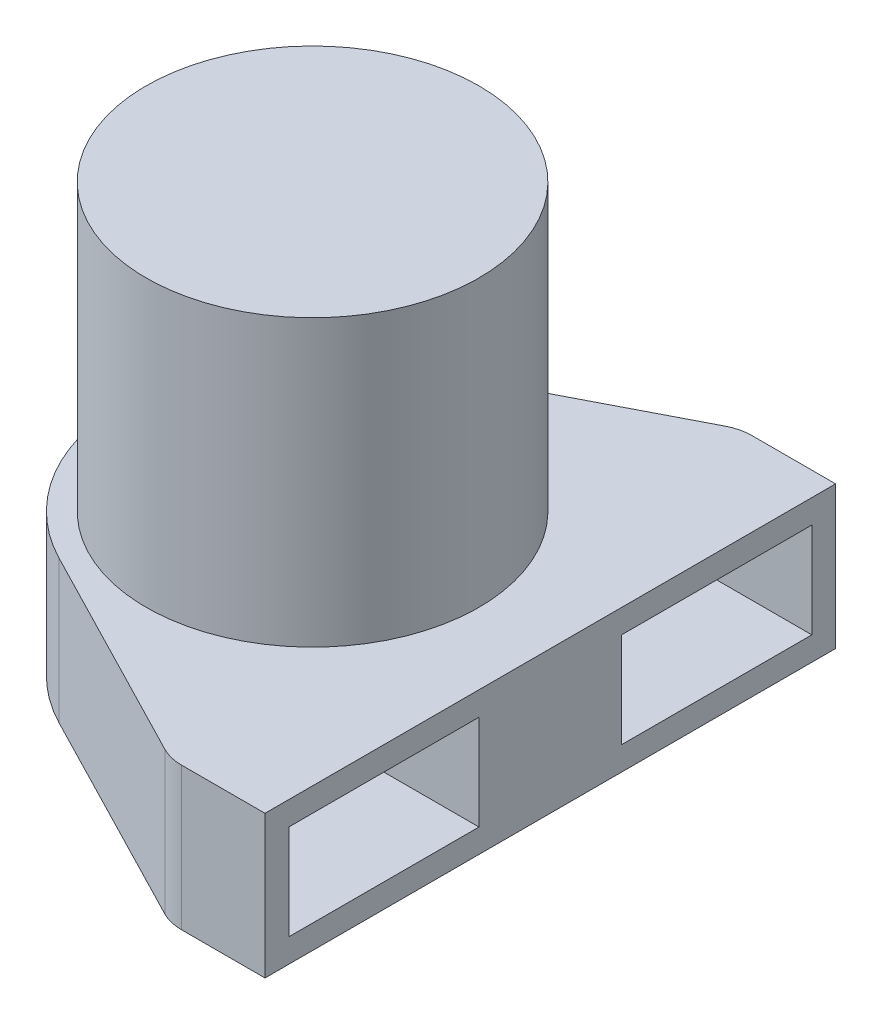
ISO-10303-21;
HEADER;
FILE_DESCRIPTION(('STEP AP214'),'2;1');
FILE_NAME('part.step','',(''),(''),'','','');
FILE_SCHEMA(('AUTOMOTIVE_DESIGN { 1 0 10303 214 1 1 1 1 }'));
ENDSEC;
DATA;
#1=APPLICATION_CONTEXT('core data for automotive mechanical design processes');
#2=APPLICATION_PROTOCOL_DEFINITION('international standard','automotive_design',2000,#1);
#3=PRODUCT_CONTEXT('',#1,'mechanical');
#4=PRODUCT('Part','Part','',(#3));
#5=PRODUCT_RELATED_PRODUCT_CATEGORY('part','',(#4));
#6=PRODUCT_DEFINITION_FORMATION('','',#4);
#7=PRODUCT_DEFINITION_CONTEXT('part definition',#1,'design');
#8=PRODUCT_DEFINITION('design','',#6,#7);
#9=PRODUCT_DEFINITION_SHAPE('','',#8);
#10=(LENGTH_UNIT() NAMED_UNIT(*) SI_UNIT(.MILLI.,.METRE.));
#11=(NAMED_UNIT(*) PLANE_ANGLE_UNIT() SI_UNIT($,.RADIAN.));
#12=(NAMED_UNIT(*) SI_UNIT($,.STERADIAN.) SOLID_ANGLE_UNIT());
#13=UNCERTAINTY_MEASURE_WITH_UNIT(LENGTH_MEASURE(1.E-05),#10,'distance_accuracy_value','');
#14=(GEOMETRIC_REPRESENTATION_CONTEXT(3) GLOBAL_UNCERTAINTY_ASSIGNED_CONTEXT((#13)) GLOBAL_UNIT_ASSIGNED_CONTEXT((#10,
#11,#12)) REPRESENTATION_CONTEXT('',''));
#15=CARTESIAN_POINT('',(0.,0.,0.));
#16=DIRECTION('',(0.,0.,1.));
#17=DIRECTION('',(1.,0.,0.));
#18=AXIS2_PLACEMENT_3D('',#15,#16,#17);
#19=CARTESIAN_POINT('',(0.,90.,0.));
#20=DIRECTION('',(0.,-1.,0.));
#21=DIRECTION('',(0.,0.,-1.));
#22=AXIS2_PLACEMENT_3D('',#19,#20,#21);
#23=CYLINDRICAL_SURFACE('',#22,35.);
#24=CARTESIAN_POINT('',(0.,30.,0.));
#25=DIRECTION('',(0.,1.,0.));
#26=DIRECTION('',(0.,0.,1.));
#27=AXIS2_PLACEMENT_3D('',#24,#25,#26);
#28=CIRCLE('',#27,35.);
#29=CARTESIAN_POINT('',(0.,30.,-35.));
#30=VERTEX_POINT('',#29);
#31=EDGE_CURVE('E38',#30,#30,#28,.T.);
#32=CARTESIAN_POINT('',(0.,90.,0.));
#33=DIRECTION('',(0.,1.,0.));
#34=DIRECTION('',(0.,0.,1.));
#35=AXIS2_PLACEMENT_3D('',#32,#33,#34);
#36=CIRCLE('',#35,35.);
#37=CARTESIAN_POINT('',(0.,90.,-35.));
#38=VERTEX_POINT('',#37);
#39=EDGE_CURVE('E11',#38,#38,#36,.T.);
#40=CARTESIAN_POINT('',(0.,30.,-35.));
#41=CARTESIAN_POINT('',(0.,30.625,-35.));
#42=CARTESIAN_POINT('',(0.,31.25,-35.));
#43=CARTESIAN_POINT('',(0.,32.5,-35.));
#44=CARTESIAN_POINT('',(0.,33.125,-35.));
#45=CARTESIAN_POINT('',(0.,34.375,-35.));
#46=CARTESIAN_POINT('',(0.,35.,-35.));
#47=CARTESIAN_POINT('',(0.,36.25,-35.));
#48=CARTESIAN_POINT('',(0.,36.875,-35.));
#49=CARTESIAN_POINT('',(0.,38.125,-35.));
#50=CARTESIAN_POINT('',(0.,38.75,-35.));
#51=CARTESIAN_POINT('',(0.,40.,-35.));
#52=CARTESIAN_POINT('',(0.,40.625,-35.));
#53=CARTESIAN_POINT('',(0.,41.875,-35.));
#54=CARTESIAN_POINT('',(0.,42.5,-35.));
#55=CARTESIAN_POINT('',(0.,43.75,-35.));
#56=CARTESIAN_POINT('',(0.,44.375,-35.));
#57=CARTESIAN_POINT('',(0.,45.625,-35.));
#58=CARTESIAN_POINT('',(0.,46.25,-35.));
#59=CARTESIAN_POINT('',(0.,47.5,-35.));
#60=CARTESIAN_POINT('',(0.,48.125,-35.));
#61=CARTESIAN_POINT('',(0.,49.375,-35.));
#62=CARTESIAN_POINT('',(0.,50.,-35.));
#63=CARTESIAN_POINT('',(0.,51.25,-35.));
#64=CARTESIAN_POINT('',(0.,51.875,-35.));
#65=CARTESIAN_POINT('',(0.,53.125,-35.));
#66=CARTESIAN_POINT('',(0.,53.75,-35.));
#67=CARTESIAN_POINT('',(0.,55.,-35.));
#68=CARTESIAN_POINT('',(0.,55.625,-35.));
#69=CARTESIAN_POINT('',(0.,56.875,-35.));
#70=CARTESIAN_POINT('',(0.,57.5,-35.));
#71=CARTESIAN_POINT('',(0.,58.75,-35.));
#72=CARTESIAN_POINT('',(0.,59.375,-35.));
#73=CARTESIAN_POINT('',(0.,60.625,-35.));
#74=CARTESIAN_POINT('',(0.,61.25,-35.));
#75=CARTESIAN_POINT('',(0.,62.5,-35.));
#76=CARTESIAN_POINT('',(0.,63.125,-35.));
#77=CARTESIAN_POINT('',(0.,64.375,-35.));
#78=CARTESIAN_POINT('',(0.,65.,-35.));
#79=CARTESIAN_POINT('',(0.,66.25,-35.));
#80=CARTESIAN_POINT('',(0.,66.875,-35.));
#81=CARTESIAN_POINT('',(0.,68.125,-35.));
#82=CARTESIAN_POINT('',(0.,68.75,-35.));
#83=CARTESIAN_POINT('',(0.,70.,-35.));
#84=CARTESIAN_POINT('',(0.,70.625,-35.));
#85=CARTESIAN_POINT('',(0.,71.875,-35.));
#86=CARTESIAN_POINT('',(0.,72.5,-35.));
#87=CARTESIAN_POINT('',(0.,73.75,-35.));
#88=CARTESIAN_POINT('',(0.,74.375,-35.));
#89=CARTESIAN_POINT('',(0.,75.625,-35.));
#90=CARTESIAN_POINT('',(0.,76.25,-35.));
#91=CARTESIAN_POINT('',(0.,77.5,-35.));
#92=CARTESIAN_POINT('',(0.,78.125,-35.));
#93=CARTESIAN_POINT('',(0.,79.375,-35.));
#94=CARTESIAN_POINT('',(0.,80.,-35.));
#95=CARTESIAN_POINT('',(0.,81.25,-35.));
#96=CARTESIAN_POINT('',(0.,81.875,-35.));
#97=CARTESIAN_POINT('',(0.,83.125,-35.));
#98=CARTESIAN_POINT('',(0.,83.75,-35.));
#99=CARTESIAN_POINT('',(0.,85.,-35.));
#100=CARTESIAN_POINT('',(0.,85.625,-35.));
#101=CARTESIAN_POINT('',(0.,86.875,-35.));
#102=CARTESIAN_POINT('',(0.,87.5,-35.));
#103=CARTESIAN_POINT('',(0.,88.75,-35.));
#104=CARTESIAN_POINT('',(0.,89.375,-35.));
#105=CARTESIAN_POINT('',(0.,90.,-35.));
#106=B_SPLINE_CURVE_WITH_KNOTS('',3,(#40,#41,#42,#43,#44,#45,#46,#47,#48,#49,#50,#51,#52,#53,
#54,#55,#56,#57,#58,#59,#60,#61,#62,#63,#64,#65,#66,#67,#68,#69,#70,#71,#72,#73,#74,#75,#76,#77,
#78,#79,#80,#81,#82,#83,#84,#85,#86,#87,#88,#89,#90,#91,#92,#93,#94,#95,#96,#97,#98,#99,#100,
#101,#102,#103,#104,#105),.UNSPECIFIED.,.F.,.F.,(4,2,2,2,2,2,2,2,2,2,2,2,2,2,2,2,2,2,2,2,2,2,2,
2,2,2,2,2,2,2,2,2,4),(0.,1.875,3.75,5.625,7.5,9.375,11.25,13.125,15.,16.875,18.75,20.625,22.5,
24.375,26.25,28.125,30.,31.875,33.75,35.625,37.5,39.375,41.25,43.125,45.,46.875,48.75,50.625,
52.5,54.375,56.25,58.125,60.),.UNSPECIFIED.);
#107=EDGE_CURVE('BSEAM35',#30,#38,#106,.T.);
#108=ORIENTED_EDGE('',*,*,#31,.T.);
#109=ORIENTED_EDGE('',*,*,#39,.F.);
#110=ORIENTED_EDGE('',*,*,#107,.T.);
#111=ORIENTED_EDGE('',*,*,#107,.F.);
#112=EDGE_LOOP('',(#108,#110,#109,#111));
#113=FACE_BOUND('',#112,.T.);
#114=ADVANCED_FACE('F35',(#113),#23,.T.);
#115=CARTESIAN_POINT('',(0.,90.,0.));
#116=DIRECTION('',(0.,1.,0.));
#117=DIRECTION('',(0.,0.,1.));
#118=AXIS2_PLACEMENT_3D('',#115,#116,#117);
#119=PLANE('',#118);
#120=ORIENTED_EDGE('',*,*,#39,.T.);
#121=EDGE_LOOP('',(#120));
#122=FACE_BOUND('',#121,.T.);
#123=ADVANCED_FACE('F324',(#122),#119,.T.);
#124=CARTESIAN_POINT('',(32.426063269964,30.,-50.));
#125=DIRECTION('',(0.,1.,0.));
#126=DIRECTION('',(0.,0.,1.));
#127=AXIS2_PLACEMENT_3D('',#124,#125,#126);
#128=PLANE('',#127);
#129=CARTESIAN_POINT('',(32.426063269964,30.,-50.));
#130=DIRECTION('',(0.,-1.,0.));
#131=DIRECTION('',(0.,0.,1.));
#132=AXIS2_PLACEMENT_3D('',#129,#130,#131);
#133=CIRCLE('',#132,10.);
#134=CARTESIAN_POINT('',(27.8436477624995,30.,-58.8882770049627));
#135=VERTEX_POINT('',#134);
#136=CARTESIAN_POINT('',(32.426063269964,30.,-60.));
#137=VERTEX_POINT('',#136);
#138=EDGE_CURVE('E216',#135,#137,#133,.T.);
#139=ORIENTED_EDGE('',*,*,#138,.F.);
#140=DIRECTION('',(0.888827700496273,0.,-0.458241550746446));
#141=VECTOR('',#140,1.);
#142=CARTESIAN_POINT('',(27.8436477624995,30.,-58.8882770049627));
#143=LINE('',#142,#141);
#144=CARTESIAN_POINT('',(-18.1383074643934,30.,-35.1819473555152));
#145=VERTEX_POINT('',#144);
#146=EDGE_CURVE('E238',#145,#135,#143,.T.);
#147=ORIENTED_EDGE('',*,*,#146,.F.);
#148=CARTESIAN_POINT('',(0.,30.,0.));
#149=DIRECTION('',(0.,-1.,0.));
#150=DIRECTION('',(0.,0.,-1.));
#151=AXIS2_PLACEMENT_3D('',#148,#149,#150);
#152=CIRCLE('',#151,39.582415507383);
#153=CARTESIAN_POINT('',(-18.1383074643933,30.,35.1819473555152));
#154=VERTEX_POINT('',#153);
#155=EDGE_CURVE('E235',#154,#145,#152,.T.);
#156=ORIENTED_EDGE('',*,*,#155,.F.);
#157=DIRECTION('',(-0.888827700496273,0.,-0.458241550746446));
#158=VECTOR('',#157,1.);
#159=CARTESIAN_POINT('',(27.8436477624995,30.,58.8882770049627));
#160=LINE('',#159,#158);
#161=CARTESIAN_POINT('',(27.8436477624995,30.,58.8882770049627));
#162=VERTEX_POINT('',#161);
#163=EDGE_CURVE('E232',#162,#154,#160,.T.);
#164=ORIENTED_EDGE('',*,*,#163,.F.);
#165=CARTESIAN_POINT('',(32.426063269964,30.,50.));
#166=DIRECTION('',(0.,-1.,0.));
#167=DIRECTION('',(0.,0.,-1.));
#168=AXIS2_PLACEMENT_3D('',#165,#166,#167);
#169=CIRCLE('',#168,10.);
#170=CARTESIAN_POINT('',(32.426063269964,30.,60.));
#171=VERTEX_POINT('',#170);
#172=EDGE_CURVE('E229',#171,#162,#169,.T.);
#173=ORIENTED_EDGE('',*,*,#172,.F.);
#174=DIRECTION('',(-1.,0.,0.));
#175=VECTOR('',#174,1.);
#176=CARTESIAN_POINT('',(50.,30.,60.));
#177=LINE('',#176,#175);
#178=CARTESIAN_POINT('',(50.,30.,60.));
#179=VERTEX_POINT('',#178);
#180=EDGE_CURVE('E226',#179,#171,#177,.T.);
#181=ORIENTED_EDGE('',*,*,#180,.F.);
#182=DIRECTION('',(0.,0.,1.));
#183=VECTOR('',#182,1.);
#184=CARTESIAN_POINT('',(50.,30.,60.));
#185=LINE('',#184,#183);
#186=CARTESIAN_POINT('',(50.,30.,-60.));
#187=VERTEX_POINT('',#186);
#188=EDGE_CURVE('E223',#187,#179,#185,.T.);
#189=ORIENTED_EDGE('',*,*,#188,.F.);
#190=DIRECTION('',(1.,0.,0.));
#191=VECTOR('',#190,1.);
#192=CARTESIAN_POINT('',(50.,30.,-60.));
#193=LINE('',#192,#191);
#194=EDGE_CURVE('E219',#137,#187,#193,.T.);
#195=ORIENTED_EDGE('',*,*,#194,.F.);
#196=EDGE_LOOP('',(#139,#147,#156,#164,#173,#181,#189,#195));
#197=FACE_BOUND('',#196,.T.);
#198=ORIENTED_EDGE('',*,*,#31,.F.);
#199=EDGE_LOOP('',(#198));
#200=FACE_BOUND('',#199,.T.);
#201=ADVANCED_FACE('F295',(#197,#200),#128,.T.);
#202=CARTESIAN_POINT('',(32.426063269964,30.,-50.));
#203=DIRECTION('',(0.,-1.,0.));
#204=DIRECTION('',(0.,0.,-1.));
#205=AXIS2_PLACEMENT_3D('',#202,#203,#204);
#206=CYLINDRICAL_SURFACE('',#205,10.);
#207=CARTESIAN_POINT('',(32.426063269964,0.,-50.));
#208=DIRECTION('',(0.,-1.,0.));
#209=DIRECTION('',(0.,0.,1.));
#210=AXIS2_PLACEMENT_3D('',#207,#208,#209);
#211=CIRCLE('',#210,10.);
#212=CARTESIAN_POINT('',(27.8436477624995,0.,-58.8882770049627));
#213=VERTEX_POINT('',#212);
#214=CARTESIAN_POINT('',(32.426063269964,0.,-60.));
#215=VERTEX_POINT('',#214);
#216=EDGE_CURVE('E210',#213,#215,#211,.T.);
#217=ORIENTED_EDGE('',*,*,#216,.F.);
#218=DIRECTION('',(0.,-1.,0.));
#219=VECTOR('',#218,1.);
#220=CARTESIAN_POINT('',(27.8436477624995,30.,-58.8882770049627));
#221=LINE('',#220,#219);
#222=EDGE_CURVE('E264',#135,#213,#221,.T.);
#223=ORIENTED_EDGE('',*,*,#222,.F.);
#224=ORIENTED_EDGE('',*,*,#138,.T.);
#225=DIRECTION('',(0.,-1.,0.));
#226=VECTOR('',#225,1.);
#227=CARTESIAN_POINT('',(32.426063269964,30.,-60.));
#228=LINE('',#227,#226);
#229=EDGE_CURVE('E241',#137,#215,#228,.T.);
#230=ORIENTED_EDGE('',*,*,#229,.T.);
#231=EDGE_LOOP('',(#217,#223,#224,#230));
#232=FACE_BOUND('',#231,.T.);
#233=ADVANCED_FACE('F281',(#232),#206,.T.);
#234=CARTESIAN_POINT('',(27.8436477624995,30.,-58.8882770049627));
#235=DIRECTION('',(-0.458241550746446,0.,-0.888827700496273));
#236=DIRECTION('',(-0.888827700496273,0.,0.458241550746447));
#237=AXIS2_PLACEMENT_3D('',#234,#235,#236);
#238=PLANE('',#237);
#239=DIRECTION('',(0.888827700496273,0.,-0.458241550746446));
#240=VECTOR('',#239,1.);
#241=CARTESIAN_POINT('',(27.8436477624995,0.,-58.8882770049627));
#242=LINE('',#241,#240);
#243=CARTESIAN_POINT('',(-18.1383074643934,0.,-35.1819473555152));
#244=VERTEX_POINT('',#243);
#245=EDGE_CURVE('E220',#244,#213,#242,.T.);
#246=ORIENTED_EDGE('',*,*,#245,.F.);
#247=DIRECTION('',(0.,-1.,0.));
#248=VECTOR('',#247,1.);
#249=CARTESIAN_POINT('',(-18.1383074643934,30.,-35.1819473555152));
#250=LINE('',#249,#248);
#251=EDGE_CURVE('E266',#145,#244,#250,.T.);
#252=ORIENTED_EDGE('',*,*,#251,.F.);
#253=ORIENTED_EDGE('',*,*,#146,.T.);
#254=ORIENTED_EDGE('',*,*,#222,.T.);
#255=EDGE_LOOP('',(#246,#252,#253,#254));
#256=FACE_BOUND('',#255,.T.);
#257=ADVANCED_FACE('F292',(#256),#238,.T.);
#258=CARTESIAN_POINT('',(0.,30.,0.));
#259=DIRECTION('',(0.,-1.,0.));
#260=DIRECTION('',(0.,0.,-1.));
#261=AXIS2_PLACEMENT_3D('',#258,#259,#260);
#262=CYLINDRICAL_SURFACE('',#261,39.582415507383);
#263=CARTESIAN_POINT('',(0.,0.,0.));
#264=DIRECTION('',(0.,-1.,0.));
#265=DIRECTION('',(0.,0.,-1.));
#266=AXIS2_PLACEMENT_3D('',#263,#264,#265);
#267=CIRCLE('',#266,39.582415507383);
#268=CARTESIAN_POINT('',(-18.1383074643933,0.,35.1819473555152));
#269=VERTEX_POINT('',#268);
#270=EDGE_CURVE('E259',#269,#244,#267,.T.);
#271=ORIENTED_EDGE('',*,*,#270,.F.);
#272=DIRECTION('',(0.,-1.,0.));
#273=VECTOR('',#272,1.);
#274=CARTESIAN_POINT('',(-18.1383074643933,30.,35.1819473555152));
#275=LINE('',#274,#273);
#276=EDGE_CURVE('E268',#154,#269,#275,.T.);
#277=ORIENTED_EDGE('',*,*,#276,.F.);
#278=ORIENTED_EDGE('',*,*,#155,.T.);
#279=ORIENTED_EDGE('',*,*,#251,.T.);
#280=EDGE_LOOP('',(#271,#277,#278,#279));
#281=FACE_BOUND('',#280,.T.);
#282=ADVANCED_FACE('F314',(#281),#262,.T.);
#283=CARTESIAN_POINT('',(27.8436477624995,30.,58.8882770049627));
#284=DIRECTION('',(-0.458241550746446,0.,0.888827700496273));
#285=DIRECTION('',(0.888827700496273,0.,0.458241550746447));
#286=AXIS2_PLACEMENT_3D('',#283,#284,#285);
#287=PLANE('',#286);
#288=DIRECTION('',(-0.888827700496273,0.,-0.458241550746446));
#289=VECTOR('',#288,1.);
#290=CARTESIAN_POINT('',(27.8436477624995,0.,58.8882770049627));
#291=LINE('',#290,#289);
#292=CARTESIAN_POINT('',(27.8436477624995,0.,58.8882770049627));
#293=VERTEX_POINT('',#292);
#294=EDGE_CURVE('E256',#293,#269,#291,.T.);
#295=ORIENTED_EDGE('',*,*,#294,.F.);
#296=DIRECTION('',(0.,-1.,0.));
#297=VECTOR('',#296,1.);
#298=CARTESIAN_POINT('',(27.8436477624995,30.,58.8882770049627));
#299=LINE('',#298,#297);
#300=EDGE_CURVE('E270',#162,#293,#299,.T.);
#301=ORIENTED_EDGE('',*,*,#300,.F.);
#302=ORIENTED_EDGE('',*,*,#163,.T.);
#303=ORIENTED_EDGE('',*,*,#276,.T.);
#304=EDGE_LOOP('',(#295,#301,#302,#303));
#305=FACE_BOUND('',#304,.T.);
#306=ADVANCED_FACE('F312',(#305),#287,.T.);
#307=CARTESIAN_POINT('',(32.426063269964,30.,50.));
#308=DIRECTION('',(0.,-1.,0.));
#309=DIRECTION('',(0.,0.,-1.));
#310=AXIS2_PLACEMENT_3D('',#307,#308,#309);
#311=CYLINDRICAL_SURFACE('',#310,10.);
#312=CARTESIAN_POINT('',(32.426063269964,0.,50.));
#313=DIRECTION('',(0.,-1.,0.));
#314=DIRECTION('',(0.,0.,-1.));
#315=AXIS2_PLACEMENT_3D('',#312,#313,#314);
#316=CIRCLE('',#315,10.);
#317=CARTESIAN_POINT('',(32.426063269964,0.,60.));
#318=VERTEX_POINT('',#317);
#319=EDGE_CURVE('E253',#318,#293,#316,.T.);
#320=ORIENTED_EDGE('',*,*,#319,.F.);
#321=DIRECTION('',(0.,-1.,0.));
#322=VECTOR('',#321,1.);
#323=CARTESIAN_POINT('',(32.426063269964,30.,60.));
#324=LINE('',#323,#322);
#325=EDGE_CURVE('E272',#171,#318,#324,.T.);
#326=ORIENTED_EDGE('',*,*,#325,.F.);
#327=ORIENTED_EDGE('',*,*,#172,.T.);
#328=ORIENTED_EDGE('',*,*,#300,.T.);
#329=EDGE_LOOP('',(#320,#326,#327,#328));
#330=FACE_BOUND('',#329,.T.);
#331=ADVANCED_FACE('F308',(#330),#311,.T.);
#332=CARTESIAN_POINT('',(50.,30.,60.));
#333=DIRECTION('',(0.,0.,1.));
#334=DIRECTION('',(1.,0.,0.));
#335=AXIS2_PLACEMENT_3D('',#332,#333,#334);
#336=PLANE('',#335);
#337=DIRECTION('',(-1.,0.,0.));
#338=VECTOR('',#337,1.);
#339=CARTESIAN_POINT('',(50.,0.,60.));
#340=LINE('',#339,#338);
#341=CARTESIAN_POINT('',(50.,0.,60.));
#342=VERTEX_POINT('',#341);
#343=EDGE_CURVE('E250',#342,#318,#340,.T.);
#344=ORIENTED_EDGE('',*,*,#343,.F.);
#345=DIRECTION('',(0.,-1.,0.));
#346=VECTOR('',#345,1.);
#347=CARTESIAN_POINT('',(50.,30.,60.));
#348=LINE('',#347,#346);
#349=EDGE_CURVE('E274',#179,#342,#348,.T.);
#350=ORIENTED_EDGE('',*,*,#349,.F.);
#351=ORIENTED_EDGE('',*,*,#180,.T.);
#352=ORIENTED_EDGE('',*,*,#325,.T.);
#353=EDGE_LOOP('',(#344,#350,#351,#352));
#354=FACE_BOUND('',#353,.T.);
#355=ADVANCED_FACE('F306',(#354),#336,.T.);
#356=CARTESIAN_POINT('',(50.,30.,60.));
#357=DIRECTION('',(1.,0.,0.));
#358=DIRECTION('',(0.,0.,-1.));
#359=AXIS2_PLACEMENT_3D('',#356,#357,#358);
#360=PLANE('',#359);
#361=DIRECTION('',(0.,0.,-1.));
#362=VECTOR('',#361,1.);
#363=CARTESIAN_POINT('',(50.,5.,-15.));
#364=LINE('',#363,#362);
#365=CARTESIAN_POINT('',(50.,5.,-15.));
#366=VERTEX_POINT('',#365);
#367=CARTESIAN_POINT('',(50.,5.,-55.));
#368=VERTEX_POINT('',#367);
#369=EDGE_CURVE('E49',#366,#368,#364,.T.);
#370=ORIENTED_EDGE('',*,*,#369,.F.);
#371=DIRECTION('',(0.,-1.,0.));
#372=VECTOR('',#371,1.);
#373=CARTESIAN_POINT('',(50.,5.,-15.));
#374=LINE('',#373,#372);
#375=CARTESIAN_POINT('',(50.,25.,-15.));
#376=VERTEX_POINT('',#375);
#377=EDGE_CURVE('E167',#376,#366,#374,.T.);
#378=ORIENTED_EDGE('',*,*,#377,.F.);
#379=DIRECTION('',(0.,0.,1.));
#380=VECTOR('',#379,1.);
#381=CARTESIAN_POINT('',(50.,25.,-15.));
#382=LINE('',#381,#380);
#383=CARTESIAN_POINT('',(50.,25.,-55.));
#384=VERTEX_POINT('',#383);
#385=EDGE_CURVE('E170',#384,#376,#382,.T.);
#386=ORIENTED_EDGE('',*,*,#385,.F.);
#387=DIRECTION('',(0.,1.,0.));
#388=VECTOR('',#387,1.);
#389=CARTESIAN_POINT('',(50.,5.,-55.));
#390=LINE('',#389,#388);
#391=EDGE_CURVE('E176',#368,#384,#390,.T.);
#392=ORIENTED_EDGE('',*,*,#391,.F.);
#393=EDGE_LOOP('',(#370,#378,#386,#392));
#394=FACE_BOUND('',#393,.T.);
#395=DIRECTION('',(0.,-1.,0.));
#396=VECTOR('',#395,1.);
#397=CARTESIAN_POINT('',(50.,5.,55.));
#398=LINE('',#397,#396);
#399=CARTESIAN_POINT('',(50.,25.,55.));
#400=VERTEX_POINT('',#399);
#401=CARTESIAN_POINT('',(50.,5.,55.));
#402=VERTEX_POINT('',#401);
#403=EDGE_CURVE('E57',#400,#402,#398,.T.);
#404=ORIENTED_EDGE('',*,*,#403,.F.);
#405=DIRECTION('',(0.,0.,1.));
#406=VECTOR('',#405,1.);
#407=CARTESIAN_POINT('',(50.,25.,15.));
#408=LINE('',#407,#406);
#409=CARTESIAN_POINT('',(50.,25.,15.));
#410=VERTEX_POINT('',#409);
#411=EDGE_CURVE('E189',#410,#400,#408,.T.);
#412=ORIENTED_EDGE('',*,*,#411,.F.);
#413=DIRECTION('',(0.,1.,0.));
#414=VECTOR('',#413,1.);
#415=CARTESIAN_POINT('',(50.,5.,15.));
#416=LINE('',#415,#414);
#417=CARTESIAN_POINT('',(50.,5.,15.));
#418=VERTEX_POINT('',#417);
#419=EDGE_CURVE('E203',#418,#410,#416,.T.);
#420=ORIENTED_EDGE('',*,*,#419,.F.);
#421=DIRECTION('',(0.,0.,-1.));
#422=VECTOR('',#421,1.);
#423=CARTESIAN_POINT('',(50.,5.,15.));
#424=LINE('',#423,#422);
#425=EDGE_CURVE('E200',#402,#418,#424,.T.);
#426=ORIENTED_EDGE('',*,*,#425,.F.);
#427=EDGE_LOOP('',(#404,#412,#420,#426));
#428=FACE_BOUND('',#427,.T.);
#429=DIRECTION('',(0.,0.,1.));
#430=VECTOR('',#429,1.);
#431=CARTESIAN_POINT('',(50.,0.,60.));
#432=LINE('',#431,#430);
#433=CARTESIAN_POINT('',(50.,0.,-60.));
#434=VERTEX_POINT('',#433);
#435=EDGE_CURVE('E247',#434,#342,#432,.T.);
#436=ORIENTED_EDGE('',*,*,#435,.F.);
#437=DIRECTION('',(0.,-1.,0.));
#438=VECTOR('',#437,1.);
#439=CARTESIAN_POINT('',(50.,30.,-60.));
#440=LINE('',#439,#438);
#441=EDGE_CURVE('E276',#187,#434,#440,.T.);
#442=ORIENTED_EDGE('',*,*,#441,.F.);
#443=ORIENTED_EDGE('',*,*,#188,.T.);
#444=ORIENTED_EDGE('',*,*,#349,.T.);
#445=EDGE_LOOP('',(#436,#442,#443,#444));
#446=FACE_BOUND('',#445,.T.);
#447=ADVANCED_FACE('F302',(#394,#428,#446),#360,.T.);
#448=CARTESIAN_POINT('',(50.,30.,-60.));
#449=DIRECTION('',(0.,0.,-1.));
#450=DIRECTION('',(-1.,0.,0.));
#451=AXIS2_PLACEMENT_3D('',#448,#449,#450);
#452=PLANE('',#451);
#453=DIRECTION('',(1.,0.,0.));
#454=VECTOR('',#453,1.);
#455=CARTESIAN_POINT('',(50.,0.,-60.));
#456=LINE('',#455,#454);
#457=EDGE_CURVE('E244',#215,#434,#456,.T.);
#458=ORIENTED_EDGE('',*,*,#457,.F.);
#459=ORIENTED_EDGE('',*,*,#229,.F.);
#460=ORIENTED_EDGE('',*,*,#194,.T.);
#461=ORIENTED_EDGE('',*,*,#441,.T.);
#462=EDGE_LOOP('',(#458,#459,#460,#461));
#463=FACE_BOUND('',#462,.T.);
#464=ADVANCED_FACE('F285',(#463),#452,.T.);
#465=CARTESIAN_POINT('',(0.,0.,0.));
#466=DIRECTION('',(0.,1.,0.));
#467=DIRECTION('',(0.,0.,1.));
#468=AXIS2_PLACEMENT_3D('',#465,#466,#467);
#469=PLANE('',#468);
#470=ORIENTED_EDGE('',*,*,#216,.T.);
#471=ORIENTED_EDGE('',*,*,#457,.T.);
#472=ORIENTED_EDGE('',*,*,#435,.T.);
#473=ORIENTED_EDGE('',*,*,#343,.T.);
#474=ORIENTED_EDGE('',*,*,#319,.T.);
#475=ORIENTED_EDGE('',*,*,#294,.T.);
#476=ORIENTED_EDGE('',*,*,#270,.T.);
#477=ORIENTED_EDGE('',*,*,#245,.T.);
#478=EDGE_LOOP('',(#470,#471,#472,#473,#474,#475,#476,#477));
#479=FACE_BOUND('',#478,.T.);
#480=ADVANCED_FACE('F288',(#479),#469,.F.);
#481=CARTESIAN_POINT('',(22.,5.,55.));
#482=DIRECTION('',(0.,0.,1.));
#483=DIRECTION('',(1.,0.,0.));
#484=AXIS2_PLACEMENT_3D('',#481,#482,#483);
#485=PLANE('',#484);
#486=ORIENTED_EDGE('',*,*,#403,.T.);
#487=DIRECTION('',(1.,0.,0.));
#488=VECTOR('',#487,1.);
#489=CARTESIAN_POINT('',(22.,5.,55.));
#490=LINE('',#489,#488);
#491=CARTESIAN_POINT('',(22.,5.,55.));
#492=VERTEX_POINT('',#491);
#493=EDGE_CURVE('E198',#492,#402,#490,.T.);
#494=ORIENTED_EDGE('',*,*,#493,.F.);
#495=DIRECTION('',(0.,-1.,0.));
#496=VECTOR('',#495,1.);
#497=CARTESIAN_POINT('',(22.,5.,55.));
#498=LINE('',#497,#496);
#499=CARTESIAN_POINT('',(22.,25.,55.));
#500=VERTEX_POINT('',#499);
#501=EDGE_CURVE('E185',#500,#492,#498,.T.);
#502=ORIENTED_EDGE('',*,*,#501,.F.);
#503=DIRECTION('',(1.,0.,0.));
#504=VECTOR('',#503,1.);
#505=CARTESIAN_POINT('',(22.,25.,55.));
#506=LINE('',#505,#504);
#507=EDGE_CURVE('E208',#500,#400,#506,.T.);
#508=ORIENTED_EDGE('',*,*,#507,.T.);
#509=EDGE_LOOP('',(#486,#494,#502,#508));
#510=FACE_BOUND('',#509,.T.);
#511=ADVANCED_FACE('F342',(#510),#485,.F.);
#512=CARTESIAN_POINT('',(22.,25.,15.));
#513=DIRECTION('',(0.,1.,0.));
#514=DIRECTION('',(0.,0.,1.));
#515=AXIS2_PLACEMENT_3D('',#512,#513,#514);
#516=PLANE('',#515);
#517=ORIENTED_EDGE('',*,*,#411,.T.);
#518=ORIENTED_EDGE('',*,*,#507,.F.);
#519=DIRECTION('',(0.,0.,1.));
#520=VECTOR('',#519,1.);
#521=CARTESIAN_POINT('',(22.,25.,15.));
#522=LINE('',#521,#520);
#523=CARTESIAN_POINT('',(22.,25.,15.));
#524=VERTEX_POINT('',#523);
#525=EDGE_CURVE('E195',#524,#500,#522,.T.);
#526=ORIENTED_EDGE('',*,*,#525,.F.);
#527=DIRECTION('',(1.,0.,0.));
#528=VECTOR('',#527,1.);
#529=CARTESIAN_POINT('',(22.,25.,15.));
#530=LINE('',#529,#528);
#531=EDGE_CURVE('E211',#524,#410,#530,.T.);
#532=ORIENTED_EDGE('',*,*,#531,.T.);
#533=EDGE_LOOP('',(#517,#518,#526,#532));
#534=FACE_BOUND('',#533,.T.);
#535=ADVANCED_FACE('F345',(#534),#516,.F.);
#536=CARTESIAN_POINT('',(22.,5.,15.));
#537=DIRECTION('',(0.,0.,-1.));
#538=DIRECTION('',(-1.,0.,0.));
#539=AXIS2_PLACEMENT_3D('',#536,#537,#538);
#540=PLANE('',#539);
#541=ORIENTED_EDGE('',*,*,#419,.T.);
#542=ORIENTED_EDGE('',*,*,#531,.F.);
#543=DIRECTION('',(0.,1.,0.));
#544=VECTOR('',#543,1.);
#545=CARTESIAN_POINT('',(22.,5.,15.));
#546=LINE('',#545,#544);
#547=CARTESIAN_POINT('',(22.,5.,15.));
#548=VERTEX_POINT('',#547);
#549=EDGE_CURVE('E192',#548,#524,#546,.T.);
#550=ORIENTED_EDGE('',*,*,#549,.F.);
#551=DIRECTION('',(1.,0.,0.));
#552=VECTOR('',#551,1.);
#553=CARTESIAN_POINT('',(22.,5.,15.));
#554=LINE('',#553,#552);
#555=EDGE_CURVE('E213',#548,#418,#554,.T.);
#556=ORIENTED_EDGE('',*,*,#555,.T.);
#557=EDGE_LOOP('',(#541,#542,#550,#556));
#558=FACE_BOUND('',#557,.T.);
#559=ADVANCED_FACE('F350',(#558),#540,.F.);
#560=CARTESIAN_POINT('',(22.,5.,15.));
#561=DIRECTION('',(0.,-1.,0.));
#562=DIRECTION('',(0.,0.,-1.));
#563=AXIS2_PLACEMENT_3D('',#560,#561,#562);
#564=PLANE('',#563);
#565=ORIENTED_EDGE('',*,*,#425,.T.);
#566=ORIENTED_EDGE('',*,*,#555,.F.);
#567=DIRECTION('',(0.,0.,-1.));
#568=VECTOR('',#567,1.);
#569=CARTESIAN_POINT('',(22.,5.,15.));
#570=LINE('',#569,#568);
#571=EDGE_CURVE('E188',#492,#548,#570,.T.);
#572=ORIENTED_EDGE('',*,*,#571,.F.);
#573=ORIENTED_EDGE('',*,*,#493,.T.);
#574=EDGE_LOOP('',(#565,#566,#572,#573));
#575=FACE_BOUND('',#574,.T.);
#576=ADVANCED_FACE('F346',(#575),#564,.F.);
#577=CARTESIAN_POINT('',(22.,0.,0.));
#578=DIRECTION('',(1.,0.,0.));
#579=DIRECTION('',(0.,0.,-1.));
#580=AXIS2_PLACEMENT_3D('',#577,#578,#579);
#581=PLANE('',#580);
#582=ORIENTED_EDGE('',*,*,#501,.T.);
#583=ORIENTED_EDGE('',*,*,#571,.T.);
#584=ORIENTED_EDGE('',*,*,#549,.T.);
#585=ORIENTED_EDGE('',*,*,#525,.T.);
#586=EDGE_LOOP('',(#582,#583,#584,#585));
#587=FACE_BOUND('',#586,.T.);
#588=ADVANCED_FACE('F349',(#587),#581,.T.);
#589=CARTESIAN_POINT('',(22.,5.,-15.));
#590=DIRECTION('',(0.,-1.,0.));
#591=DIRECTION('',(0.,0.,-1.));
#592=AXIS2_PLACEMENT_3D('',#589,#590,#591);
#593=PLANE('',#592);
#594=ORIENTED_EDGE('',*,*,#369,.T.);
#595=DIRECTION('',(1.,0.,0.));
#596=VECTOR('',#595,1.);
#597=CARTESIAN_POINT('',(22.,5.,-55.));
#598=LINE('',#597,#596);
#599=CARTESIAN_POINT('',(22.,5.,-55.));
#600=VERTEX_POINT('',#599);
#601=EDGE_CURVE('E145',#600,#368,#598,.T.);
#602=ORIENTED_EDGE('',*,*,#601,.F.);
#603=DIRECTION('',(0.,0.,-1.));
#604=VECTOR('',#603,1.);
#605=CARTESIAN_POINT('',(22.,5.,-15.));
#606=LINE('',#605,#604);
#607=CARTESIAN_POINT('',(22.,5.,-15.));
#608=VERTEX_POINT('',#607);
#609=EDGE_CURVE('E149',#608,#600,#606,.T.);
#610=ORIENTED_EDGE('',*,*,#609,.F.);
#611=DIRECTION('',(1.,0.,0.));
#612=VECTOR('',#611,1.);
#613=CARTESIAN_POINT('',(22.,5.,-15.));
#614=LINE('',#613,#612);
#615=EDGE_CURVE('E180',#608,#366,#614,.T.);
#616=ORIENTED_EDGE('',*,*,#615,.T.);
#617=EDGE_LOOP('',(#594,#602,#610,#616));
#618=FACE_BOUND('',#617,.T.);
#619=ADVANCED_FACE('F147',(#618),#593,.F.);
#620=CARTESIAN_POINT('',(22.,5.,-15.));
#621=DIRECTION('',(0.,0.,1.));
#622=DIRECTION('',(1.,0.,0.));
#623=AXIS2_PLACEMENT_3D('',#620,#621,#622);
#624=PLANE('',#623);
#625=ORIENTED_EDGE('',*,*,#377,.T.);
#626=ORIENTED_EDGE('',*,*,#615,.F.);
#627=DIRECTION('',(0.,-1.,0.));
#628=VECTOR('',#627,1.);
#629=CARTESIAN_POINT('',(22.,5.,-15.));
#630=LINE('',#629,#628);
#631=CARTESIAN_POINT('',(22.,25.,-15.));
#632=VERTEX_POINT('',#631);
#633=EDGE_CURVE('E155',#632,#608,#630,.T.);
#634=ORIENTED_EDGE('',*,*,#633,.F.);
#635=DIRECTION('',(1.,0.,0.));
#636=VECTOR('',#635,1.);
#637=CARTESIAN_POINT('',(22.,25.,-15.));
#638=LINE('',#637,#636);
#639=EDGE_CURVE('E182',#632,#376,#638,.T.);
#640=ORIENTED_EDGE('',*,*,#639,.T.);
#641=EDGE_LOOP('',(#625,#626,#634,#640));
#642=FACE_BOUND('',#641,.T.);
#643=ADVANCED_FACE('F363',(#642),#624,.F.);
#644=CARTESIAN_POINT('',(22.,25.,-15.));
#645=DIRECTION('',(0.,1.,0.));
#646=DIRECTION('',(0.,0.,1.));
#647=AXIS2_PLACEMENT_3D('',#644,#645,#646);
#648=PLANE('',#647);
#649=ORIENTED_EDGE('',*,*,#385,.T.);
#650=ORIENTED_EDGE('',*,*,#639,.F.);
#651=DIRECTION('',(0.,0.,1.));
#652=VECTOR('',#651,1.);
#653=CARTESIAN_POINT('',(22.,25.,-15.));
#654=LINE('',#653,#652);
#655=CARTESIAN_POINT('',(22.,25.,-55.));
#656=VERTEX_POINT('',#655);
#657=EDGE_CURVE('E163',#656,#632,#654,.T.);
#658=ORIENTED_EDGE('',*,*,#657,.F.);
#659=DIRECTION('',(1.,0.,0.));
#660=VECTOR('',#659,1.);
#661=CARTESIAN_POINT('',(22.,25.,-55.));
#662=LINE('',#661,#660);
#663=EDGE_CURVE('E154',#656,#384,#662,.T.);
#664=ORIENTED_EDGE('',*,*,#663,.T.);
#665=EDGE_LOOP('',(#649,#650,#658,#664));
#666=FACE_BOUND('',#665,.T.);
#667=ADVANCED_FACE('F366',(#666),#648,.F.);
#668=CARTESIAN_POINT('',(22.,5.,-55.));
#669=DIRECTION('',(0.,0.,-1.));
#670=DIRECTION('',(-1.,0.,0.));
#671=AXIS2_PLACEMENT_3D('',#668,#669,#670);
#672=PLANE('',#671);
#673=ORIENTED_EDGE('',*,*,#391,.T.);
#674=ORIENTED_EDGE('',*,*,#663,.F.);
#675=DIRECTION('',(0.,1.,0.));
#676=VECTOR('',#675,1.);
#677=CARTESIAN_POINT('',(22.,5.,-55.));
#678=LINE('',#677,#676);
#679=EDGE_CURVE('E158',#600,#656,#678,.T.);
#680=ORIENTED_EDGE('',*,*,#679,.F.);
#681=ORIENTED_EDGE('',*,*,#601,.T.);
#682=EDGE_LOOP('',(#673,#674,#680,#681));
#683=FACE_BOUND('',#682,.T.);
#684=ADVANCED_FACE('F159',(#683),#672,.F.);
#685=CARTESIAN_POINT('',(22.,0.,0.));
#686=DIRECTION('',(1.,0.,0.));
#687=DIRECTION('',(0.,0.,-1.));
#688=AXIS2_PLACEMENT_3D('',#685,#686,#687);
#689=PLANE('',#688);
#690=ORIENTED_EDGE('',*,*,#609,.T.);
#691=ORIENTED_EDGE('',*,*,#679,.T.);
#692=ORIENTED_EDGE('',*,*,#657,.T.);
#693=ORIENTED_EDGE('',*,*,#633,.T.);
#694=EDGE_LOOP('',(#690,#691,#692,#693));
#695=FACE_BOUND('',#694,.T.);
#696=ADVANCED_FACE('F165',(#695),#689,.T.);
#697=CLOSED_SHELL('',(#114,#123,#201,#233,#257,#282,#306,#331,#355,#447,#464,#480,#511,#535,
#559,#576,#588,#619,#643,#667,#684,#696));
#698=MANIFOLD_SOLID_BREP('B2',#697);
#699=ADVANCED_BREP_SHAPE_REPRESENTATION('',(#18,#698),#14);
#700=SHAPE_DEFINITION_REPRESENTATION(#9,#699);
ENDSEC;
END-ISO-10303-21;
